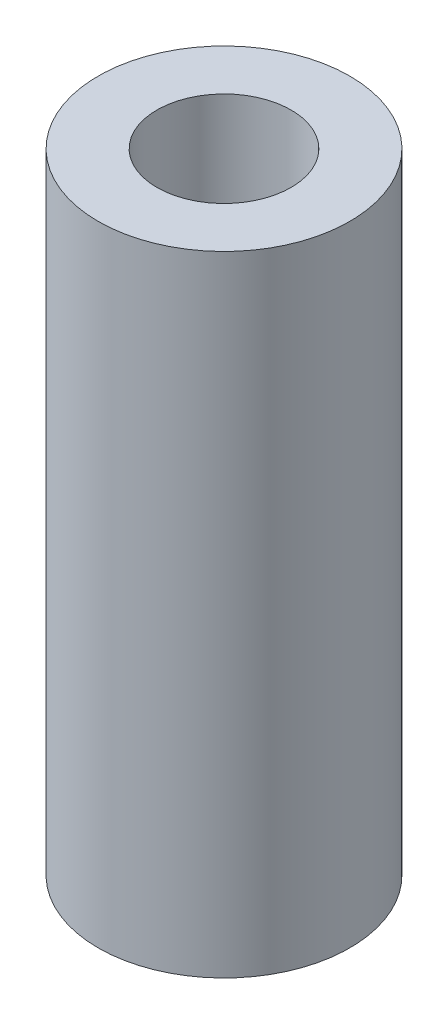
ISO-10303-21;
HEADER;
FILE_DESCRIPTION(('STEP AP214'),'2;1');
FILE_NAME('part.step','',(''),(''),'','','');
FILE_SCHEMA(('AUTOMOTIVE_DESIGN { 1 0 10303 214 1 1 1 1 }'));
ENDSEC;
DATA;
#1=APPLICATION_CONTEXT('core data for automotive mechanical design processes');
#2=APPLICATION_PROTOCOL_DEFINITION('international standard','automotive_design',2000,#1);
#3=PRODUCT_CONTEXT('',#1,'mechanical');
#4=PRODUCT('Part','Part','',(#3));
#5=PRODUCT_RELATED_PRODUCT_CATEGORY('part','',(#4));
#6=PRODUCT_DEFINITION_FORMATION('','',#4);
#7=PRODUCT_DEFINITION_CONTEXT('part definition',#1,'design');
#8=PRODUCT_DEFINITION('design','',#6,#7);
#9=PRODUCT_DEFINITION_SHAPE('','',#8);
#10=(LENGTH_UNIT() NAMED_UNIT(*) SI_UNIT(.MILLI.,.METRE.));
#11=(NAMED_UNIT(*) PLANE_ANGLE_UNIT() SI_UNIT($,.RADIAN.));
#12=(NAMED_UNIT(*) SI_UNIT($,.STERADIAN.) SOLID_ANGLE_UNIT());
#13=UNCERTAINTY_MEASURE_WITH_UNIT(LENGTH_MEASURE(1.E-05),#10,'distance_accuracy_value','');
#14=(GEOMETRIC_REPRESENTATION_CONTEXT(3) GLOBAL_UNCERTAINTY_ASSIGNED_CONTEXT((#13)) GLOBAL_UNIT_ASSIGNED_CONTEXT((#10,
#11,#12)) REPRESENTATION_CONTEXT('',''));
#15=CARTESIAN_POINT('',(0.,0.,0.));
#16=DIRECTION('',(0.,0.,1.));
#17=DIRECTION('',(1.,0.,0.));
#18=AXIS2_PLACEMENT_3D('',#15,#16,#17);
#19=CARTESIAN_POINT('',(0.,15.,0.));
#20=DIRECTION('',(0.,1.,0.));
#21=DIRECTION('',(0.,0.,1.));
#22=AXIS2_PLACEMENT_3D('',#19,#20,#21);
#23=PLANE('',#22);
#24=CARTESIAN_POINT('',(0.,15.,0.));
#25=DIRECTION('',(0.,1.,0.));
#26=DIRECTION('',(0.,0.,1.));
#27=AXIS2_PLACEMENT_3D('',#24,#25,#26);
#28=CIRCLE('',#27,3.);
#29=CARTESIAN_POINT('',(0.,15.,3.));
#30=VERTEX_POINT('',#29);
#31=EDGE_CURVE('E10',#30,#30,#28,.T.);
#32=ORIENTED_EDGE('',*,*,#31,.T.);
#33=EDGE_LOOP('',(#32));
#34=FACE_BOUND('',#33,.T.);
#35=CARTESIAN_POINT('',(0.,15.,0.));
#36=DIRECTION('',(0.,1.,0.));
#37=DIRECTION('',(0.,0.,1.));
#38=AXIS2_PLACEMENT_3D('',#35,#36,#37);
#39=CIRCLE('',#38,1.6);
#40=CARTESIAN_POINT('',(0.,15.,1.6));
#41=VERTEX_POINT('',#40);
#42=EDGE_CURVE('E42',#41,#41,#39,.T.);
#43=ORIENTED_EDGE('',*,*,#42,.F.);
#44=EDGE_LOOP('',(#43));
#45=FACE_BOUND('',#44,.T.);
#46=ADVANCED_FACE('F31',(#34,#45),#23,.T.);
#47=CARTESIAN_POINT('',(0.,0.,0.));
#48=DIRECTION('',(0.,1.,0.));
#49=DIRECTION('',(0.,0.,1.));
#50=AXIS2_PLACEMENT_3D('',#47,#48,#49);
#51=PLANE('',#50);
#52=CARTESIAN_POINT('',(0.,0.,0.));
#53=DIRECTION('',(0.,1.,0.));
#54=DIRECTION('',(0.,0.,1.));
#55=AXIS2_PLACEMENT_3D('',#52,#53,#54);
#56=CIRCLE('',#55,3.);
#57=CARTESIAN_POINT('',(0.,0.,3.));
#58=VERTEX_POINT('',#57);
#59=EDGE_CURVE('E35',#58,#58,#56,.T.);
#60=ORIENTED_EDGE('',*,*,#59,.F.);
#61=EDGE_LOOP('',(#60));
#62=FACE_BOUND('',#61,.T.);
#63=CARTESIAN_POINT('',(0.,0.,0.));
#64=DIRECTION('',(0.,1.,0.));
#65=DIRECTION('',(0.,0.,1.));
#66=AXIS2_PLACEMENT_3D('',#63,#64,#65);
#67=CIRCLE('',#66,1.6);
#68=CARTESIAN_POINT('',(0.,0.,1.6));
#69=VERTEX_POINT('',#68);
#70=EDGE_CURVE('E44',#69,#69,#67,.T.);
#71=ORIENTED_EDGE('',*,*,#70,.T.);
#72=EDGE_LOOP('',(#71));
#73=FACE_BOUND('',#72,.T.);
#74=ADVANCED_FACE('F54',(#62,#73),#51,.F.);
#75=CARTESIAN_POINT('',(0.,15.,0.));
#76=DIRECTION('',(0.,-1.,0.));
#77=DIRECTION('',(0.,0.,-1.));
#78=AXIS2_PLACEMENT_3D('',#75,#76,#77);
#79=CYLINDRICAL_SURFACE('',#78,3.);
#80=ORIENTED_EDGE('',*,*,#31,.F.);
#81=EDGE_LOOP('',(#80));
#82=FACE_BOUND('',#81,.T.);
#83=ORIENTED_EDGE('',*,*,#59,.T.);
#84=EDGE_LOOP('',(#83));
#85=FACE_BOUND('',#84,.T.);
#86=ADVANCED_FACE('F33',(#82,#85),#79,.T.);
#87=CARTESIAN_POINT('',(0.,15.,0.));
#88=DIRECTION('',(0.,-1.,0.));
#89=DIRECTION('',(0.,0.,-1.));
#90=AXIS2_PLACEMENT_3D('',#87,#88,#89);
#91=CYLINDRICAL_SURFACE('',#90,1.6);
#92=ORIENTED_EDGE('',*,*,#42,.T.);
#93=EDGE_LOOP('',(#92));
#94=FACE_BOUND('',#93,.T.);
#95=ORIENTED_EDGE('',*,*,#70,.F.);
#96=EDGE_LOOP('',(#95));
#97=FACE_BOUND('',#96,.T.);
#98=ADVANCED_FACE('F50',(#94,#97),#91,.F.);
#99=CLOSED_SHELL('',(#46,#74,#86,#98));
#100=MANIFOLD_SOLID_BREP('B2',#99);
#101=ADVANCED_BREP_SHAPE_REPRESENTATION('',(#18,#100),#14);
#102=SHAPE_DEFINITION_REPRESENTATION(#9,#101);
ENDSEC;
END-ISO-10303-21;
